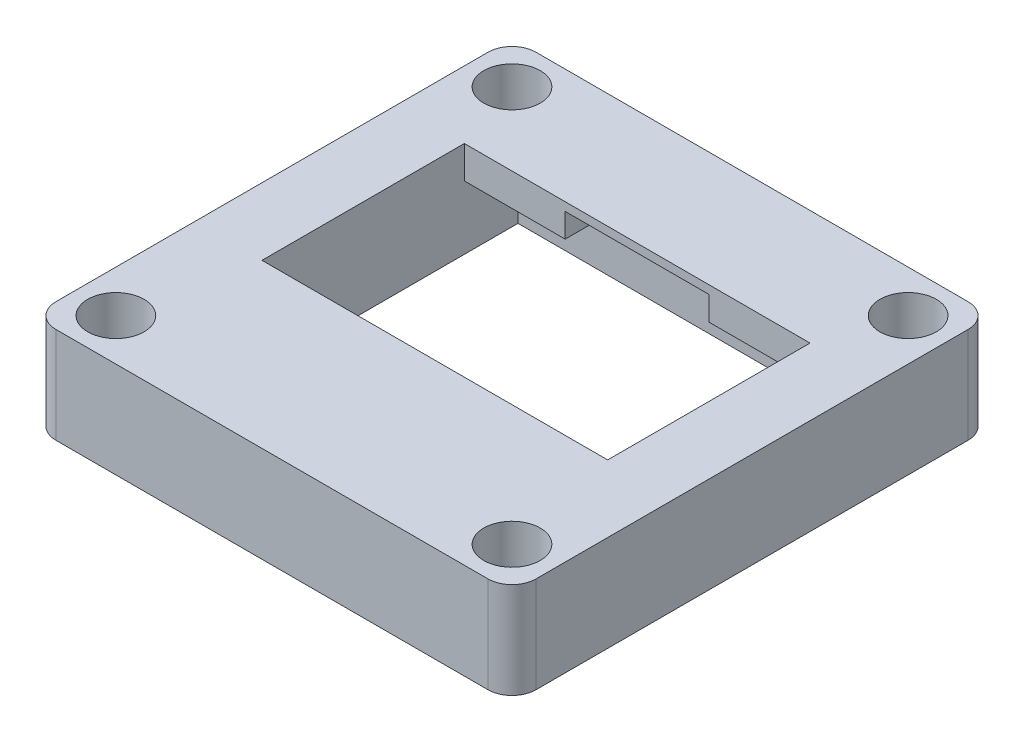
ISO-10303-21;
HEADER;
FILE_DESCRIPTION(('STEP AP214'),'2;1');
FILE_NAME('part.step','',(''),(''),'','','');
FILE_SCHEMA(('AUTOMOTIVE_DESIGN { 1 0 10303 214 1 1 1 1 }'));
ENDSEC;
DATA;
#1=APPLICATION_CONTEXT('core data for automotive mechanical design processes');
#2=APPLICATION_PROTOCOL_DEFINITION('international standard','automotive_design',2000,#1);
#3=PRODUCT_CONTEXT('',#1,'mechanical');
#4=PRODUCT('Part','Part','',(#3));
#5=PRODUCT_RELATED_PRODUCT_CATEGORY('part','',(#4));
#6=PRODUCT_DEFINITION_FORMATION('','',#4);
#7=PRODUCT_DEFINITION_CONTEXT('part definition',#1,'design');
#8=PRODUCT_DEFINITION('design','',#6,#7);
#9=PRODUCT_DEFINITION_SHAPE('','',#8);
#10=(LENGTH_UNIT() NAMED_UNIT(*) SI_UNIT(.MILLI.,.METRE.));
#11=(NAMED_UNIT(*) PLANE_ANGLE_UNIT() SI_UNIT($,.RADIAN.));
#12=(NAMED_UNIT(*) SI_UNIT($,.STERADIAN.) SOLID_ANGLE_UNIT());
#13=UNCERTAINTY_MEASURE_WITH_UNIT(LENGTH_MEASURE(1.E-05),#10,'distance_accuracy_value','');
#14=(GEOMETRIC_REPRESENTATION_CONTEXT(3) GLOBAL_UNCERTAINTY_ASSIGNED_CONTEXT((#13)) GLOBAL_UNIT_ASSIGNED_CONTEXT((#10,
#11,#12)) REPRESENTATION_CONTEXT('',''));
#15=CARTESIAN_POINT('',(0.,0.,0.));
#16=DIRECTION('',(0.,0.,1.));
#17=DIRECTION('',(1.,0.,0.));
#18=AXIS2_PLACEMENT_3D('',#15,#16,#17);
#19=CARTESIAN_POINT('',(-16.5,8.,16.5));
#20=DIRECTION('',(0.,-1.,0.));
#21=DIRECTION('',(0.,0.,-1.));
#22=AXIS2_PLACEMENT_3D('',#19,#20,#21);
#23=CYLINDRICAL_SURFACE('',#22,1.25);
#24=CARTESIAN_POINT('',(-16.5,0.,16.5));
#25=DIRECTION('',(0.,-1.,0.));
#26=DIRECTION('',(0.,0.,-1.));
#27=AXIS2_PLACEMENT_3D('',#24,#25,#26);
#28=CIRCLE('',#27,1.25);
#29=CARTESIAN_POINT('',(-16.5,0.,15.25));
#30=VERTEX_POINT('',#29);
#31=EDGE_CURVE('E238',#30,#30,#28,.T.);
#32=ORIENTED_EDGE('',*,*,#31,.T.);
#33=EDGE_LOOP('',(#32));
#34=FACE_BOUND('',#33,.T.);
#35=CARTESIAN_POINT('',(-16.5,4.,16.5));
#36=DIRECTION('',(0.,1.,0.));
#37=DIRECTION('',(0.,0.,1.));
#38=AXIS2_PLACEMENT_3D('',#35,#36,#37);
#39=CIRCLE('',#38,1.25);
#40=CARTESIAN_POINT('',(-16.5,4.,17.75));
#41=VERTEX_POINT('',#40);
#42=EDGE_CURVE('E40',#41,#41,#39,.F.);
#43=ORIENTED_EDGE('',*,*,#42,.F.);
#44=EDGE_LOOP('',(#43));
#45=FACE_BOUND('',#44,.T.);
#46=ADVANCED_FACE('F36',(#34,#45),#23,.F.);
#47=CARTESIAN_POINT('',(-16.5,8.,-16.5));
#48=DIRECTION('',(0.,-1.,0.));
#49=DIRECTION('',(0.,0.,-1.));
#50=AXIS2_PLACEMENT_3D('',#47,#48,#49);
#51=CYLINDRICAL_SURFACE('',#50,1.25);
#52=CARTESIAN_POINT('',(-16.5,0.,-16.5));
#53=DIRECTION('',(0.,-1.,0.));
#54=DIRECTION('',(0.,0.,-1.));
#55=AXIS2_PLACEMENT_3D('',#52,#53,#54);
#56=CIRCLE('',#55,1.25);
#57=CARTESIAN_POINT('',(-16.5,0.,-17.75));
#58=VERTEX_POINT('',#57);
#59=EDGE_CURVE('E417',#58,#58,#56,.T.);
#60=ORIENTED_EDGE('',*,*,#59,.T.);
#61=EDGE_LOOP('',(#60));
#62=FACE_BOUND('',#61,.T.);
#63=CARTESIAN_POINT('',(-16.5,4.,-16.5));
#64=DIRECTION('',(0.,1.,0.));
#65=DIRECTION('',(0.,0.,1.));
#66=AXIS2_PLACEMENT_3D('',#63,#64,#65);
#67=CIRCLE('',#66,1.25);
#68=CARTESIAN_POINT('',(-16.5,4.,-15.25));
#69=VERTEX_POINT('',#68);
#70=EDGE_CURVE('E412',#69,#69,#67,.F.);
#71=ORIENTED_EDGE('',*,*,#70,.F.);
#72=EDGE_LOOP('',(#71));
#73=FACE_BOUND('',#72,.T.);
#74=ADVANCED_FACE('F512',(#62,#73),#51,.F.);
#75=CARTESIAN_POINT('',(16.5,8.,-16.5));
#76=DIRECTION('',(0.,-1.,0.));
#77=DIRECTION('',(0.,0.,-1.));
#78=AXIS2_PLACEMENT_3D('',#75,#76,#77);
#79=CYLINDRICAL_SURFACE('',#78,1.25);
#80=CARTESIAN_POINT('',(16.5,0.,-16.5));
#81=DIRECTION('',(0.,-1.,0.));
#82=DIRECTION('',(0.,0.,-1.));
#83=AXIS2_PLACEMENT_3D('',#80,#81,#82);
#84=CIRCLE('',#83,1.25);
#85=CARTESIAN_POINT('',(16.5,0.,-17.75));
#86=VERTEX_POINT('',#85);
#87=EDGE_CURVE('E421',#86,#86,#84,.T.);
#88=ORIENTED_EDGE('',*,*,#87,.T.);
#89=EDGE_LOOP('',(#88));
#90=FACE_BOUND('',#89,.T.);
#91=CARTESIAN_POINT('',(16.5,4.,-16.5));
#92=DIRECTION('',(0.,1.,0.));
#93=DIRECTION('',(0.,0.,1.));
#94=AXIS2_PLACEMENT_3D('',#91,#92,#93);
#95=CIRCLE('',#94,1.25);
#96=CARTESIAN_POINT('',(16.5,4.,-15.25));
#97=VERTEX_POINT('',#96);
#98=EDGE_CURVE('E409',#97,#97,#95,.F.);
#99=ORIENTED_EDGE('',*,*,#98,.F.);
#100=EDGE_LOOP('',(#99));
#101=FACE_BOUND('',#100,.T.);
#102=ADVANCED_FACE('F518',(#90,#101),#79,.F.);
#103=CARTESIAN_POINT('',(16.5,8.,16.5));
#104=DIRECTION('',(0.,-1.,0.));
#105=DIRECTION('',(0.,0.,-1.));
#106=AXIS2_PLACEMENT_3D('',#103,#104,#105);
#107=CYLINDRICAL_SURFACE('',#106,1.25);
#108=CARTESIAN_POINT('',(16.5,0.,16.5));
#109=DIRECTION('',(0.,-1.,0.));
#110=DIRECTION('',(0.,0.,-1.));
#111=AXIS2_PLACEMENT_3D('',#108,#109,#110);
#112=CIRCLE('',#111,1.25);
#113=CARTESIAN_POINT('',(16.5,0.,15.25));
#114=VERTEX_POINT('',#113);
#115=EDGE_CURVE('E243',#114,#114,#112,.T.);
#116=ORIENTED_EDGE('',*,*,#115,.T.);
#117=EDGE_LOOP('',(#116));
#118=FACE_BOUND('',#117,.T.);
#119=CARTESIAN_POINT('',(16.5,4.,16.5));
#120=DIRECTION('',(0.,1.,0.));
#121=DIRECTION('',(0.,0.,1.));
#122=AXIS2_PLACEMENT_3D('',#119,#120,#121);
#123=CIRCLE('',#122,1.25);
#124=CARTESIAN_POINT('',(16.5,4.,17.75));
#125=VERTEX_POINT('',#124);
#126=EDGE_CURVE('E406',#125,#125,#123,.F.);
#127=ORIENTED_EDGE('',*,*,#126,.F.);
#128=EDGE_LOOP('',(#127));
#129=FACE_BOUND('',#128,.T.);
#130=ADVANCED_FACE('F615',(#118,#129),#107,.F.);
#131=CARTESIAN_POINT('',(-14.4,49.4424902726658,-14.9));
#132=DIRECTION('',(-1.,0.,0.));
#133=DIRECTION('',(0.,0.,1.));
#134=AXIS2_PLACEMENT_3D('',#131,#132,#133);
#135=PLANE('',#134);
#136=DIRECTION('',(0.,0.,1.));
#137=VECTOR('',#136,1.);
#138=CARTESIAN_POINT('',(-14.4,7.5,6.43));
#139=LINE('',#138,#137);
#140=CARTESIAN_POINT('',(-14.4,7.5,6.43));
#141=VERTEX_POINT('',#140);
#142=CARTESIAN_POINT('',(-14.4,7.5,10.43));
#143=VERTEX_POINT('',#142);
#144=EDGE_CURVE('E226',#141,#143,#139,.T.);
#145=ORIENTED_EDGE('',*,*,#144,.T.);
#146=DIRECTION('',(0.,-1.,0.));
#147=VECTOR('',#146,1.);
#148=CARTESIAN_POINT('',(-14.4,8.,10.43));
#149=LINE('',#148,#147);
#150=CARTESIAN_POINT('',(-14.4,5.3,10.43));
#151=VERTEX_POINT('',#150);
#152=EDGE_CURVE('E210',#143,#151,#149,.T.);
#153=ORIENTED_EDGE('',*,*,#152,.T.);
#154=DIRECTION('',(0.,0.,-1.));
#155=VECTOR('',#154,1.);
#156=CARTESIAN_POINT('',(-14.4,5.3,-14.9));
#157=LINE('',#156,#155);
#158=CARTESIAN_POINT('',(-14.4,5.3,14.9));
#159=VERTEX_POINT('',#158);
#160=EDGE_CURVE('E344',#159,#151,#157,.T.);
#161=ORIENTED_EDGE('',*,*,#160,.F.);
#162=DIRECTION('',(0.,-1.,0.));
#163=VECTOR('',#162,1.);
#164=CARTESIAN_POINT('',(-14.4,49.4424902726658,14.9));
#165=LINE('',#164,#163);
#166=CARTESIAN_POINT('',(-14.4,0.,14.9));
#167=VERTEX_POINT('',#166);
#168=EDGE_CURVE('E333',#159,#167,#165,.T.);
#169=ORIENTED_EDGE('',*,*,#168,.T.);
#170=DIRECTION('',(0.,0.,-1.));
#171=VECTOR('',#170,1.);
#172=CARTESIAN_POINT('',(-14.4,0.,-14.9));
#173=LINE('',#172,#171);
#174=CARTESIAN_POINT('',(-14.4,0.,-14.9));
#175=VERTEX_POINT('',#174);
#176=EDGE_CURVE('E322',#167,#175,#173,.T.);
#177=ORIENTED_EDGE('',*,*,#176,.T.);
#178=DIRECTION('',(0.,-1.,0.));
#179=VECTOR('',#178,1.);
#180=CARTESIAN_POINT('',(-14.4,49.4424902726658,-14.9));
#181=LINE('',#180,#179);
#182=CARTESIAN_POINT('',(-14.4,5.3,-14.9));
#183=VERTEX_POINT('',#182);
#184=EDGE_CURVE('E346',#183,#175,#181,.T.);
#185=ORIENTED_EDGE('',*,*,#184,.F.);
#186=CARTESIAN_POINT('',(-14.4,5.3,-10.43));
#187=VERTEX_POINT('',#186);
#188=EDGE_CURVE('E347',#187,#183,#157,.T.);
#189=ORIENTED_EDGE('',*,*,#188,.F.);
#190=DIRECTION('',(0.,-1.,0.));
#191=VECTOR('',#190,1.);
#192=CARTESIAN_POINT('',(-14.4,8.,-10.43));
#193=LINE('',#192,#191);
#194=CARTESIAN_POINT('',(-14.4,8.,-10.43));
#195=VERTEX_POINT('',#194);
#196=EDGE_CURVE('E222',#195,#187,#193,.T.);
#197=ORIENTED_EDGE('',*,*,#196,.F.);
#198=DIRECTION('',(0.,0.,-1.));
#199=VECTOR('',#198,1.);
#200=CARTESIAN_POINT('',(-14.4,8.,-10.43));
#201=LINE('',#200,#199);
#202=CARTESIAN_POINT('',(-14.4,8.,6.43));
#203=VERTEX_POINT('',#202);
#204=EDGE_CURVE('E301',#203,#195,#201,.T.);
#205=ORIENTED_EDGE('',*,*,#204,.F.);
#206=DIRECTION('',(0.,1.,0.));
#207=VECTOR('',#206,1.);
#208=CARTESIAN_POINT('',(-14.4,8.,6.43));
#209=LINE('',#208,#207);
#210=EDGE_CURVE('E229',#141,#203,#209,.T.);
#211=ORIENTED_EDGE('',*,*,#210,.F.);
#212=EDGE_LOOP('',(#145,#153,#161,#169,#177,#185,#189,#197,#205,#211));
#213=FACE_BOUND('',#212,.T.);
#214=ADVANCED_FACE('F227',(#213),#135,.F.);
#215=CARTESIAN_POINT('',(14.4,49.4424902726658,-14.9));
#216=DIRECTION('',(1.,0.,0.));
#217=DIRECTION('',(0.,0.,-1.));
#218=AXIS2_PLACEMENT_3D('',#215,#216,#217);
#219=PLANE('',#218);
#220=DIRECTION('',(0.,0.,1.));
#221=VECTOR('',#220,1.);
#222=CARTESIAN_POINT('',(14.4,7.5,6.43));
#223=LINE('',#222,#221);
#224=CARTESIAN_POINT('',(14.4,7.5,6.43));
#225=VERTEX_POINT('',#224);
#226=CARTESIAN_POINT('',(14.4,7.5,10.43));
#227=VERTEX_POINT('',#226);
#228=EDGE_CURVE('E233',#225,#227,#223,.T.);
#229=ORIENTED_EDGE('',*,*,#228,.F.);
#230=DIRECTION('',(0.,-1.,0.));
#231=VECTOR('',#230,1.);
#232=CARTESIAN_POINT('',(14.4,8.,6.43));
#233=LINE('',#232,#231);
#234=CARTESIAN_POINT('',(14.4,8.,6.43));
#235=VERTEX_POINT('',#234);
#236=EDGE_CURVE('E430',#235,#225,#233,.T.);
#237=ORIENTED_EDGE('',*,*,#236,.F.);
#238=DIRECTION('',(0.,0.,1.));
#239=VECTOR('',#238,1.);
#240=CARTESIAN_POINT('',(14.4,8.,-10.43));
#241=LINE('',#240,#239);
#242=CARTESIAN_POINT('',(14.4,8.,-10.43));
#243=VERTEX_POINT('',#242);
#244=EDGE_CURVE('E298',#243,#235,#241,.T.);
#245=ORIENTED_EDGE('',*,*,#244,.F.);
#246=DIRECTION('',(0.,-1.,0.));
#247=VECTOR('',#246,1.);
#248=CARTESIAN_POINT('',(14.4,8.,-10.43));
#249=LINE('',#248,#247);
#250=CARTESIAN_POINT('',(14.4,5.3,-10.43));
#251=VERTEX_POINT('',#250);
#252=EDGE_CURVE('E313',#243,#251,#249,.T.);
#253=ORIENTED_EDGE('',*,*,#252,.T.);
#254=DIRECTION('',(0.,0.,1.));
#255=VECTOR('',#254,1.);
#256=CARTESIAN_POINT('',(14.4,5.3,-14.9));
#257=LINE('',#256,#255);
#258=CARTESIAN_POINT('',(14.4,5.3,-14.9));
#259=VERTEX_POINT('',#258);
#260=EDGE_CURVE('E334',#259,#251,#257,.T.);
#261=ORIENTED_EDGE('',*,*,#260,.F.);
#262=DIRECTION('',(0.,-1.,0.));
#263=VECTOR('',#262,1.);
#264=CARTESIAN_POINT('',(14.4,49.4424902726658,-14.9));
#265=LINE('',#264,#263);
#266=CARTESIAN_POINT('',(14.4,0.,-14.9));
#267=VERTEX_POINT('',#266);
#268=EDGE_CURVE('E342',#259,#267,#265,.T.);
#269=ORIENTED_EDGE('',*,*,#268,.T.);
#270=DIRECTION('',(0.,0.,1.));
#271=VECTOR('',#270,1.);
#272=CARTESIAN_POINT('',(14.4,0.,-14.9));
#273=LINE('',#272,#271);
#274=CARTESIAN_POINT('',(14.4,0.,14.9));
#275=VERTEX_POINT('',#274);
#276=EDGE_CURVE('E316',#267,#275,#273,.T.);
#277=ORIENTED_EDGE('',*,*,#276,.T.);
#278=DIRECTION('',(0.,-1.,0.));
#279=VECTOR('',#278,1.);
#280=CARTESIAN_POINT('',(14.4,49.4424902726658,14.9));
#281=LINE('',#280,#279);
#282=CARTESIAN_POINT('',(14.4,5.3,14.9));
#283=VERTEX_POINT('',#282);
#284=EDGE_CURVE('E337',#283,#275,#281,.T.);
#285=ORIENTED_EDGE('',*,*,#284,.F.);
#286=CARTESIAN_POINT('',(14.4,5.3,10.43));
#287=VERTEX_POINT('',#286);
#288=EDGE_CURVE('E338',#287,#283,#257,.T.);
#289=ORIENTED_EDGE('',*,*,#288,.F.);
#290=DIRECTION('',(0.,-1.,0.));
#291=VECTOR('',#290,1.);
#292=CARTESIAN_POINT('',(14.4,8.,10.43));
#293=LINE('',#292,#291);
#294=EDGE_CURVE('E223',#227,#287,#293,.T.);
#295=ORIENTED_EDGE('',*,*,#294,.F.);
#296=EDGE_LOOP('',(#229,#237,#245,#253,#261,#269,#277,#285,#289,#295));
#297=FACE_BOUND('',#296,.T.);
#298=ADVANCED_FACE('F441',(#297),#219,.F.);
#299=CARTESIAN_POINT('',(-14.4,8.,10.43));
#300=DIRECTION('',(0.,0.,1.));
#301=DIRECTION('',(1.,0.,0.));
#302=AXIS2_PLACEMENT_3D('',#299,#300,#301);
#303=PLANE('',#302);
#304=DIRECTION('',(-1.,0.,0.));
#305=VECTOR('',#304,1.);
#306=CARTESIAN_POINT('',(-14.4,7.5,10.43));
#307=LINE('',#306,#305);
#308=EDGE_CURVE('E214',#227,#143,#307,.T.);
#309=ORIENTED_EDGE('',*,*,#308,.F.);
#310=ORIENTED_EDGE('',*,*,#294,.T.);
#311=DIRECTION('',(-1.,0.,0.));
#312=VECTOR('',#311,1.);
#313=CARTESIAN_POINT('',(-14.4,5.3,10.43));
#314=LINE('',#313,#312);
#315=CARTESIAN_POINT('',(6.,5.3,10.43));
#316=VERTEX_POINT('',#315);
#317=EDGE_CURVE('E307',#287,#316,#314,.T.);
#318=ORIENTED_EDGE('',*,*,#317,.T.);
#319=DIRECTION('',(0.,-1.,0.));
#320=VECTOR('',#319,1.);
#321=CARTESIAN_POINT('',(6.,20.8055027234389,10.43));
#322=LINE('',#321,#320);
#323=CARTESIAN_POINT('',(6.,7.3,10.43));
#324=VERTEX_POINT('',#323);
#325=EDGE_CURVE('E282',#324,#316,#322,.T.);
#326=ORIENTED_EDGE('',*,*,#325,.F.);
#327=DIRECTION('',(1.,0.,0.));
#328=VECTOR('',#327,1.);
#329=CARTESIAN_POINT('',(-6.,7.3,10.43));
#330=LINE('',#329,#328);
#331=CARTESIAN_POINT('',(-6.,7.3,10.43));
#332=VERTEX_POINT('',#331);
#333=EDGE_CURVE('E278',#332,#324,#330,.T.);
#334=ORIENTED_EDGE('',*,*,#333,.F.);
#335=DIRECTION('',(0.,-1.,0.));
#336=VECTOR('',#335,1.);
#337=CARTESIAN_POINT('',(-6.,20.8055027234389,10.43));
#338=LINE('',#337,#336);
#339=CARTESIAN_POINT('',(-6.,5.3,10.43));
#340=VERTEX_POINT('',#339);
#341=EDGE_CURVE('E285',#332,#340,#338,.T.);
#342=ORIENTED_EDGE('',*,*,#341,.T.);
#343=EDGE_CURVE('E218',#340,#151,#314,.T.);
#344=ORIENTED_EDGE('',*,*,#343,.T.);
#345=ORIENTED_EDGE('',*,*,#152,.F.);
#346=EDGE_LOOP('',(#309,#310,#318,#326,#334,#342,#344,#345));
#347=FACE_BOUND('',#346,.T.);
#348=ADVANCED_FACE('F212',(#347),#303,.F.);
#349=CARTESIAN_POINT('',(0.,5.3,0.));
#350=DIRECTION('',(0.,1.,0.));
#351=DIRECTION('',(0.,0.,1.));
#352=AXIS2_PLACEMENT_3D('',#349,#350,#351);
#353=PLANE('',#352);
#354=DIRECTION('',(1.,0.,0.));
#355=VECTOR('',#354,1.);
#356=CARTESIAN_POINT('',(-14.4,5.3,-14.9));
#357=LINE('',#356,#355);
#358=CARTESIAN_POINT('',(-6.,5.3,-14.9));
#359=VERTEX_POINT('',#358);
#360=EDGE_CURVE('E339',#183,#359,#357,.T.);
#361=ORIENTED_EDGE('',*,*,#360,.T.);
#362=DIRECTION('',(0.,0.,-1.));
#363=VECTOR('',#362,1.);
#364=CARTESIAN_POINT('',(-6.,5.3,-10.43));
#365=LINE('',#364,#363);
#366=CARTESIAN_POINT('',(-6.,5.3,-10.43));
#367=VERTEX_POINT('',#366);
#368=EDGE_CURVE('E250',#367,#359,#365,.T.);
#369=ORIENTED_EDGE('',*,*,#368,.F.);
#370=DIRECTION('',(1.,0.,0.));
#371=VECTOR('',#370,1.);
#372=CARTESIAN_POINT('',(-14.4,5.3,-10.43));
#373=LINE('',#372,#371);
#374=EDGE_CURVE('E302',#187,#367,#373,.T.);
#375=ORIENTED_EDGE('',*,*,#374,.F.);
#376=ORIENTED_EDGE('',*,*,#188,.T.);
#377=EDGE_LOOP('',(#361,#369,#375,#376));
#378=FACE_BOUND('',#377,.T.);
#379=ADVANCED_FACE('F498',(#378),#353,.F.);
#380=DIRECTION('',(-1.,0.,0.));
#381=VECTOR('',#380,1.);
#382=CARTESIAN_POINT('',(-14.4,5.3,14.9));
#383=LINE('',#382,#381);
#384=CARTESIAN_POINT('',(6.,5.3,14.9));
#385=VERTEX_POINT('',#384);
#386=EDGE_CURVE('E330',#283,#385,#383,.T.);
#387=ORIENTED_EDGE('',*,*,#386,.T.);
#388=DIRECTION('',(0.,0.,1.));
#389=VECTOR('',#388,1.);
#390=CARTESIAN_POINT('',(6.,5.3,10.43));
#391=LINE('',#390,#389);
#392=EDGE_CURVE('E275',#316,#385,#391,.T.);
#393=ORIENTED_EDGE('',*,*,#392,.F.);
#394=ORIENTED_EDGE('',*,*,#317,.F.);
#395=ORIENTED_EDGE('',*,*,#288,.T.);
#396=EDGE_LOOP('',(#387,#393,#394,#395));
#397=FACE_BOUND('',#396,.T.);
#398=ADVANCED_FACE('F449',(#397),#353,.F.);
#399=ORIENTED_EDGE('',*,*,#343,.F.);
#400=DIRECTION('',(0.,0.,-1.));
#401=VECTOR('',#400,1.);
#402=CARTESIAN_POINT('',(-6.,5.3,10.43));
#403=LINE('',#402,#401);
#404=CARTESIAN_POINT('',(-6.,5.3,14.9));
#405=VERTEX_POINT('',#404);
#406=EDGE_CURVE('E274',#405,#340,#403,.T.);
#407=ORIENTED_EDGE('',*,*,#406,.F.);
#408=EDGE_CURVE('E321',#405,#159,#383,.T.);
#409=ORIENTED_EDGE('',*,*,#408,.T.);
#410=ORIENTED_EDGE('',*,*,#160,.T.);
#411=EDGE_LOOP('',(#399,#407,#409,#410));
#412=FACE_BOUND('',#411,.T.);
#413=ADVANCED_FACE('F464',(#412),#353,.F.);
#414=CARTESIAN_POINT('',(6.,5.3,-10.43));
#415=VERTEX_POINT('',#414);
#416=EDGE_CURVE('E310',#415,#251,#373,.T.);
#417=ORIENTED_EDGE('',*,*,#416,.F.);
#418=DIRECTION('',(0.,0.,1.));
#419=VECTOR('',#418,1.);
#420=CARTESIAN_POINT('',(6.,5.3,-10.43));
#421=LINE('',#420,#419);
#422=CARTESIAN_POINT('',(6.,5.3,-14.9));
#423=VERTEX_POINT('',#422);
#424=EDGE_CURVE('E249',#423,#415,#421,.T.);
#425=ORIENTED_EDGE('',*,*,#424,.F.);
#426=EDGE_CURVE('E343',#423,#259,#357,.T.);
#427=ORIENTED_EDGE('',*,*,#426,.T.);
#428=ORIENTED_EDGE('',*,*,#260,.T.);
#429=EDGE_LOOP('',(#417,#425,#427,#428));
#430=FACE_BOUND('',#429,.T.);
#431=ADVANCED_FACE('F484',(#430),#353,.F.);
#432=CARTESIAN_POINT('',(20.,8.,-20.));
#433=DIRECTION('',(-1.,0.,0.));
#434=DIRECTION('',(0.,0.,1.));
#435=AXIS2_PLACEMENT_3D('',#432,#433,#434);
#436=PLANE('',#435);
#437=DIRECTION('',(0.,0.,-1.));
#438=VECTOR('',#437,1.);
#439=CARTESIAN_POINT('',(20.,0.,-20.));
#440=LINE('',#439,#438);
#441=CARTESIAN_POINT('',(20.,0.,18.));
#442=VERTEX_POINT('',#441);
#443=CARTESIAN_POINT('',(20.,0.,-18.));
#444=VERTEX_POINT('',#443);
#445=EDGE_CURVE('E353',#442,#444,#440,.T.);
#446=ORIENTED_EDGE('',*,*,#445,.T.);
#447=DIRECTION('',(0.,-1.,0.));
#448=VECTOR('',#447,1.);
#449=CARTESIAN_POINT('',(20.,8.,-18.));
#450=LINE('',#449,#448);
#451=CARTESIAN_POINT('',(20.,8.,-18.));
#452=VERTEX_POINT('',#451);
#453=EDGE_CURVE('E402',#444,#452,#450,.F.);
#454=ORIENTED_EDGE('',*,*,#453,.T.);
#455=DIRECTION('',(0.,0.,-1.));
#456=VECTOR('',#455,1.);
#457=CARTESIAN_POINT('',(20.,8.,-20.));
#458=LINE('',#457,#456);
#459=CARTESIAN_POINT('',(20.,8.,18.));
#460=VERTEX_POINT('',#459);
#461=EDGE_CURVE('E354',#460,#452,#458,.T.);
#462=ORIENTED_EDGE('',*,*,#461,.F.);
#463=DIRECTION('',(0.,-1.,0.));
#464=VECTOR('',#463,1.);
#465=CARTESIAN_POINT('',(20.,8.,18.));
#466=LINE('',#465,#464);
#467=EDGE_CURVE('E399',#460,#442,#466,.T.);
#468=ORIENTED_EDGE('',*,*,#467,.T.);
#469=EDGE_LOOP('',(#446,#454,#462,#468));
#470=FACE_BOUND('',#469,.T.);
#471=ADVANCED_FACE('F539',(#470),#436,.F.);
#472=CARTESIAN_POINT('',(-20.,8.,-20.));
#473=DIRECTION('',(0.,0.,1.));
#474=DIRECTION('',(1.,0.,0.));
#475=AXIS2_PLACEMENT_3D('',#472,#473,#474);
#476=PLANE('',#475);
#477=DIRECTION('',(-1.,0.,0.));
#478=VECTOR('',#477,1.);
#479=CARTESIAN_POINT('',(-20.,0.,-20.));
#480=LINE('',#479,#478);
#481=CARTESIAN_POINT('',(18.,0.,-20.));
#482=VERTEX_POINT('',#481);
#483=CARTESIAN_POINT('',(-18.,0.,-20.));
#484=VERTEX_POINT('',#483);
#485=EDGE_CURVE('E368',#482,#484,#480,.T.);
#486=ORIENTED_EDGE('',*,*,#485,.T.);
#487=DIRECTION('',(0.,-1.,0.));
#488=VECTOR('',#487,1.);
#489=CARTESIAN_POINT('',(-18.,8.,-20.));
#490=LINE('',#489,#488);
#491=CARTESIAN_POINT('',(-18.,8.,-20.));
#492=VERTEX_POINT('',#491);
#493=EDGE_CURVE('E390',#484,#492,#490,.F.);
#494=ORIENTED_EDGE('',*,*,#493,.T.);
#495=DIRECTION('',(-1.,0.,0.));
#496=VECTOR('',#495,1.);
#497=CARTESIAN_POINT('',(-20.,8.,-20.));
#498=LINE('',#497,#496);
#499=CARTESIAN_POINT('',(18.,8.,-20.));
#500=VERTEX_POINT('',#499);
#501=EDGE_CURVE('E357',#500,#492,#498,.T.);
#502=ORIENTED_EDGE('',*,*,#501,.F.);
#503=DIRECTION('',(0.,-1.,0.));
#504=VECTOR('',#503,1.);
#505=CARTESIAN_POINT('',(18.,8.,-20.));
#506=LINE('',#505,#504);
#507=EDGE_CURVE('E387',#500,#482,#506,.T.);
#508=ORIENTED_EDGE('',*,*,#507,.T.);
#509=EDGE_LOOP('',(#486,#494,#502,#508));
#510=FACE_BOUND('',#509,.T.);
#511=ADVANCED_FACE('F558',(#510),#476,.F.);
#512=CARTESIAN_POINT('',(-20.,8.,-20.));
#513=DIRECTION('',(1.,0.,0.));
#514=DIRECTION('',(0.,0.,-1.));
#515=AXIS2_PLACEMENT_3D('',#512,#513,#514);
#516=PLANE('',#515);
#517=DIRECTION('',(0.,0.,1.));
#518=VECTOR('',#517,1.);
#519=CARTESIAN_POINT('',(-20.,8.,-20.));
#520=LINE('',#519,#518);
#521=CARTESIAN_POINT('',(-20.,8.,-18.));
#522=VERTEX_POINT('',#521);
#523=CARTESIAN_POINT('',(-20.,8.,18.));
#524=VERTEX_POINT('',#523);
#525=EDGE_CURVE('E361',#522,#524,#520,.T.);
#526=ORIENTED_EDGE('',*,*,#525,.F.);
#527=DIRECTION('',(0.,-1.,0.));
#528=VECTOR('',#527,1.);
#529=CARTESIAN_POINT('',(-20.,8.,-18.));
#530=LINE('',#529,#528);
#531=CARTESIAN_POINT('',(-20.,0.,-18.));
#532=VERTEX_POINT('',#531);
#533=EDGE_CURVE('E376',#522,#532,#530,.T.);
#534=ORIENTED_EDGE('',*,*,#533,.T.);
#535=DIRECTION('',(0.,0.,1.));
#536=VECTOR('',#535,1.);
#537=CARTESIAN_POINT('',(-20.,0.,-20.));
#538=LINE('',#537,#536);
#539=CARTESIAN_POINT('',(-20.,0.,18.));
#540=VERTEX_POINT('',#539);
#541=EDGE_CURVE('E371',#532,#540,#538,.T.);
#542=ORIENTED_EDGE('',*,*,#541,.T.);
#543=DIRECTION('',(0.,-1.,0.));
#544=VECTOR('',#543,1.);
#545=CARTESIAN_POINT('',(-20.,8.,18.));
#546=LINE('',#545,#544);
#547=EDGE_CURVE('E365',#540,#524,#546,.F.);
#548=ORIENTED_EDGE('',*,*,#547,.T.);
#549=EDGE_LOOP('',(#526,#534,#542,#548));
#550=FACE_BOUND('',#549,.T.);
#551=ADVANCED_FACE('F564',(#550),#516,.F.);
#552=CARTESIAN_POINT('',(-20.,8.,20.));
#553=DIRECTION('',(0.,0.,-1.));
#554=DIRECTION('',(-1.,0.,0.));
#555=AXIS2_PLACEMENT_3D('',#552,#553,#554);
#556=PLANE('',#555);
#557=DIRECTION('',(1.,0.,0.));
#558=VECTOR('',#557,1.);
#559=CARTESIAN_POINT('',(-20.,0.,20.));
#560=LINE('',#559,#558);
#561=CARTESIAN_POINT('',(-18.,0.,20.));
#562=VERTEX_POINT('',#561);
#563=CARTESIAN_POINT('',(18.,0.,20.));
#564=VERTEX_POINT('',#563);
#565=EDGE_CURVE('E358',#562,#564,#560,.T.);
#566=ORIENTED_EDGE('',*,*,#565,.T.);
#567=DIRECTION('',(0.,-1.,0.));
#568=VECTOR('',#567,1.);
#569=CARTESIAN_POINT('',(18.,8.,20.));
#570=LINE('',#569,#568);
#571=CARTESIAN_POINT('',(18.,8.,20.));
#572=VERTEX_POINT('',#571);
#573=EDGE_CURVE('E12',#564,#572,#570,.F.);
#574=ORIENTED_EDGE('',*,*,#573,.T.);
#575=DIRECTION('',(1.,0.,0.));
#576=VECTOR('',#575,1.);
#577=CARTESIAN_POINT('',(-20.,8.,20.));
#578=LINE('',#577,#576);
#579=CARTESIAN_POINT('',(-18.,8.,20.));
#580=VERTEX_POINT('',#579);
#581=EDGE_CURVE('E363',#580,#572,#578,.T.);
#582=ORIENTED_EDGE('',*,*,#581,.F.);
#583=DIRECTION('',(0.,-1.,0.));
#584=VECTOR('',#583,1.);
#585=CARTESIAN_POINT('',(-18.,8.,20.));
#586=LINE('',#585,#584);
#587=EDGE_CURVE('E45',#580,#562,#586,.T.);
#588=ORIENTED_EDGE('',*,*,#587,.T.);
#589=EDGE_LOOP('',(#566,#574,#582,#588));
#590=FACE_BOUND('',#589,.T.);
#591=ADVANCED_FACE('F569',(#590),#556,.F.);
#592=CARTESIAN_POINT('',(0.,8.,0.));
#593=DIRECTION('',(0.,1.,0.));
#594=DIRECTION('',(0.,0.,1.));
#595=AXIS2_PLACEMENT_3D('',#592,#593,#594);
#596=PLANE('',#595);
#597=CARTESIAN_POINT('',(16.5,8.,-16.5));
#598=DIRECTION('',(0.,1.,0.));
#599=DIRECTION('',(0.,0.,1.));
#600=AXIS2_PLACEMENT_3D('',#597,#598,#599);
#601=CIRCLE('',#600,2.35);
#602=CARTESIAN_POINT('',(16.5,8.,-14.15));
#603=VERTEX_POINT('',#602);
#604=EDGE_CURVE('E680',#603,#603,#601,.T.);
#605=ORIENTED_EDGE('',*,*,#604,.F.);
#606=EDGE_LOOP('',(#605));
#607=FACE_BOUND('',#606,.T.);
#608=CARTESIAN_POINT('',(16.5,8.,16.5));
#609=DIRECTION('',(0.,1.,0.));
#610=DIRECTION('',(0.,0.,1.));
#611=AXIS2_PLACEMENT_3D('',#608,#609,#610);
#612=CIRCLE('',#611,2.35);
#613=CARTESIAN_POINT('',(16.5,8.,18.85));
#614=VERTEX_POINT('',#613);
#615=EDGE_CURVE('E674',#614,#614,#612,.T.);
#616=ORIENTED_EDGE('',*,*,#615,.F.);
#617=EDGE_LOOP('',(#616));
#618=FACE_BOUND('',#617,.T.);
#619=CARTESIAN_POINT('',(-16.5,8.,16.5));
#620=DIRECTION('',(0.,1.,0.));
#621=DIRECTION('',(0.,0.,1.));
#622=AXIS2_PLACEMENT_3D('',#619,#620,#621);
#623=CIRCLE('',#622,2.35);
#624=CARTESIAN_POINT('',(-16.5,8.,18.85));
#625=VERTEX_POINT('',#624);
#626=EDGE_CURVE('E664',#625,#625,#623,.T.);
#627=ORIENTED_EDGE('',*,*,#626,.F.);
#628=EDGE_LOOP('',(#627));
#629=FACE_BOUND('',#628,.T.);
#630=CARTESIAN_POINT('',(-16.5,8.,-16.5));
#631=DIRECTION('',(0.,1.,0.));
#632=DIRECTION('',(0.,0.,1.));
#633=AXIS2_PLACEMENT_3D('',#630,#631,#632);
#634=CIRCLE('',#633,2.35);
#635=CARTESIAN_POINT('',(-16.5,8.,-14.15));
#636=VERTEX_POINT('',#635);
#637=EDGE_CURVE('E663',#636,#636,#634,.T.);
#638=ORIENTED_EDGE('',*,*,#637,.F.);
#639=EDGE_LOOP('',(#638));
#640=FACE_BOUND('',#639,.T.);
#641=DIRECTION('',(1.,0.,0.));
#642=VECTOR('',#641,1.);
#643=CARTESIAN_POINT('',(-14.4,8.,6.43));
#644=LINE('',#643,#642);
#645=EDGE_CURVE('E240',#203,#235,#644,.T.);
#646=ORIENTED_EDGE('',*,*,#645,.F.);
#647=ORIENTED_EDGE('',*,*,#204,.T.);
#648=DIRECTION('',(1.,0.,0.));
#649=VECTOR('',#648,1.);
#650=CARTESIAN_POINT('',(-14.4,8.,-10.43));
#651=LINE('',#650,#649);
#652=EDGE_CURVE('E304',#195,#243,#651,.T.);
#653=ORIENTED_EDGE('',*,*,#652,.T.);
#654=ORIENTED_EDGE('',*,*,#244,.T.);
#655=EDGE_LOOP('',(#646,#647,#653,#654));
#656=FACE_BOUND('',#655,.T.);
#657=ORIENTED_EDGE('',*,*,#501,.T.);
#658=CARTESIAN_POINT('',(-18.,8.,-18.));
#659=DIRECTION('',(0.,1.,0.));
#660=DIRECTION('',(0.,0.,1.));
#661=AXIS2_PLACEMENT_3D('',#658,#659,#660);
#662=CIRCLE('',#661,2.);
#663=EDGE_CURVE('E397',#492,#522,#662,.T.);
#664=ORIENTED_EDGE('',*,*,#663,.T.);
#665=ORIENTED_EDGE('',*,*,#525,.T.);
#666=CARTESIAN_POINT('',(-18.,8.,18.));
#667=DIRECTION('',(0.,1.,0.));
#668=DIRECTION('',(0.,0.,1.));
#669=AXIS2_PLACEMENT_3D('',#666,#667,#668);
#670=CIRCLE('',#669,2.);
#671=EDGE_CURVE('E58',#524,#580,#670,.T.);
#672=ORIENTED_EDGE('',*,*,#671,.T.);
#673=ORIENTED_EDGE('',*,*,#581,.T.);
#674=CARTESIAN_POINT('',(18.,8.,18.));
#675=DIRECTION('',(0.,1.,0.));
#676=DIRECTION('',(0.,0.,1.));
#677=AXIS2_PLACEMENT_3D('',#674,#675,#676);
#678=CIRCLE('',#677,2.);
#679=EDGE_CURVE('E393',#572,#460,#678,.T.);
#680=ORIENTED_EDGE('',*,*,#679,.T.);
#681=ORIENTED_EDGE('',*,*,#461,.T.);
#682=CARTESIAN_POINT('',(18.,8.,-18.));
#683=DIRECTION('',(0.,1.,0.));
#684=DIRECTION('',(0.,0.,1.));
#685=AXIS2_PLACEMENT_3D('',#682,#683,#684);
#686=CIRCLE('',#685,2.);
#687=EDGE_CURVE('E395',#452,#500,#686,.T.);
#688=ORIENTED_EDGE('',*,*,#687,.T.);
#689=EDGE_LOOP('',(#657,#664,#665,#672,#673,#680,#681,#688));
#690=FACE_BOUND('',#689,.T.);
#691=ADVANCED_FACE('F436',(#607,#618,#629,#640,#656,#690),#596,.T.);
#692=CARTESIAN_POINT('',(0.,0.,0.));
#693=DIRECTION('',(0.,1.,0.));
#694=DIRECTION('',(0.,0.,1.));
#695=AXIS2_PLACEMENT_3D('',#692,#693,#694);
#696=PLANE('',#695);
#697=ORIENTED_EDGE('',*,*,#115,.F.);
#698=EDGE_LOOP('',(#697));
#699=FACE_BOUND('',#698,.T.);
#700=ORIENTED_EDGE('',*,*,#87,.F.);
#701=EDGE_LOOP('',(#700));
#702=FACE_BOUND('',#701,.T.);
#703=ORIENTED_EDGE('',*,*,#59,.F.);
#704=EDGE_LOOP('',(#703));
#705=FACE_BOUND('',#704,.T.);
#706=ORIENTED_EDGE('',*,*,#31,.F.);
#707=EDGE_LOOP('',(#706));
#708=FACE_BOUND('',#707,.T.);
#709=ORIENTED_EDGE('',*,*,#176,.F.);
#710=DIRECTION('',(-1.,0.,0.));
#711=VECTOR('',#710,1.);
#712=CARTESIAN_POINT('',(-14.4,0.,14.9));
#713=LINE('',#712,#711);
#714=EDGE_CURVE('E325',#275,#167,#713,.T.);
#715=ORIENTED_EDGE('',*,*,#714,.F.);
#716=ORIENTED_EDGE('',*,*,#276,.F.);
#717=DIRECTION('',(1.,0.,0.));
#718=VECTOR('',#717,1.);
#719=CARTESIAN_POINT('',(-14.4,0.,-14.9));
#720=LINE('',#719,#718);
#721=EDGE_CURVE('E319',#175,#267,#720,.T.);
#722=ORIENTED_EDGE('',*,*,#721,.F.);
#723=EDGE_LOOP('',(#709,#715,#716,#722));
#724=FACE_BOUND('',#723,.T.);
#725=ORIENTED_EDGE('',*,*,#541,.F.);
#726=CARTESIAN_POINT('',(-18.,0.,-18.));
#727=DIRECTION('',(0.,1.,0.));
#728=DIRECTION('',(0.,0.,1.));
#729=AXIS2_PLACEMENT_3D('',#726,#727,#728);
#730=CIRCLE('',#729,2.);
#731=EDGE_CURVE('E385',#532,#484,#730,.F.);
#732=ORIENTED_EDGE('',*,*,#731,.T.);
#733=ORIENTED_EDGE('',*,*,#485,.F.);
#734=CARTESIAN_POINT('',(18.,0.,-18.));
#735=DIRECTION('',(0.,1.,0.));
#736=DIRECTION('',(0.,0.,1.));
#737=AXIS2_PLACEMENT_3D('',#734,#735,#736);
#738=CIRCLE('',#737,2.);
#739=EDGE_CURVE('E383',#482,#444,#738,.F.);
#740=ORIENTED_EDGE('',*,*,#739,.T.);
#741=ORIENTED_EDGE('',*,*,#445,.F.);
#742=CARTESIAN_POINT('',(18.,0.,18.));
#743=DIRECTION('',(0.,1.,0.));
#744=DIRECTION('',(0.,0.,1.));
#745=AXIS2_PLACEMENT_3D('',#742,#743,#744);
#746=CIRCLE('',#745,2.);
#747=EDGE_CURVE('E381',#442,#564,#746,.F.);
#748=ORIENTED_EDGE('',*,*,#747,.T.);
#749=ORIENTED_EDGE('',*,*,#565,.F.);
#750=CARTESIAN_POINT('',(-18.,0.,18.));
#751=DIRECTION('',(0.,1.,0.));
#752=DIRECTION('',(0.,0.,1.));
#753=AXIS2_PLACEMENT_3D('',#750,#751,#752);
#754=CIRCLE('',#753,2.);
#755=EDGE_CURVE('E379',#562,#540,#754,.F.);
#756=ORIENTED_EDGE('',*,*,#755,.T.);
#757=EDGE_LOOP('',(#725,#732,#733,#740,#741,#748,#749,#756));
#758=FACE_BOUND('',#757,.T.);
#759=ADVANCED_FACE('F475',(#699,#702,#705,#708,#724,#758),#696,.F.);
#760=CARTESIAN_POINT('',(-14.4,49.4424902726658,14.9));
#761=DIRECTION('',(0.,0.,1.));
#762=DIRECTION('',(1.,0.,0.));
#763=AXIS2_PLACEMENT_3D('',#760,#761,#762);
#764=PLANE('',#763);
#765=ORIENTED_EDGE('',*,*,#284,.T.);
#766=ORIENTED_EDGE('',*,*,#714,.T.);
#767=ORIENTED_EDGE('',*,*,#168,.F.);
#768=ORIENTED_EDGE('',*,*,#408,.F.);
#769=DIRECTION('',(0.,-1.,0.));
#770=VECTOR('',#769,1.);
#771=CARTESIAN_POINT('',(-6.,20.8055027234389,14.9));
#772=LINE('',#771,#770);
#773=CARTESIAN_POINT('',(-6.,7.3,14.9));
#774=VERTEX_POINT('',#773);
#775=EDGE_CURVE('E286',#774,#405,#772,.T.);
#776=ORIENTED_EDGE('',*,*,#775,.F.);
#777=DIRECTION('',(-1.,0.,0.));
#778=VECTOR('',#777,1.);
#779=CARTESIAN_POINT('',(-6.,7.3,14.9));
#780=LINE('',#779,#778);
#781=CARTESIAN_POINT('',(6.,7.3,14.9));
#782=VERTEX_POINT('',#781);
#783=EDGE_CURVE('E287',#782,#774,#780,.T.);
#784=ORIENTED_EDGE('',*,*,#783,.F.);
#785=DIRECTION('',(0.,-1.,0.));
#786=VECTOR('',#785,1.);
#787=CARTESIAN_POINT('',(6.,20.8055027234389,14.9));
#788=LINE('',#787,#786);
#789=EDGE_CURVE('E290',#782,#385,#788,.T.);
#790=ORIENTED_EDGE('',*,*,#789,.T.);
#791=ORIENTED_EDGE('',*,*,#386,.F.);
#792=EDGE_LOOP('',(#765,#766,#767,#768,#776,#784,#790,#791));
#793=FACE_BOUND('',#792,.T.);
#794=ADVANCED_FACE('F467',(#793),#764,.F.);
#795=CARTESIAN_POINT('',(-14.4,49.4424902726658,-14.9));
#796=DIRECTION('',(0.,0.,-1.));
#797=DIRECTION('',(-1.,0.,0.));
#798=AXIS2_PLACEMENT_3D('',#795,#796,#797);
#799=PLANE('',#798);
#800=ORIENTED_EDGE('',*,*,#184,.T.);
#801=ORIENTED_EDGE('',*,*,#721,.T.);
#802=ORIENTED_EDGE('',*,*,#268,.F.);
#803=ORIENTED_EDGE('',*,*,#426,.F.);
#804=DIRECTION('',(0.,-1.,0.));
#805=VECTOR('',#804,1.);
#806=CARTESIAN_POINT('',(6.,20.8055027234389,-14.9));
#807=LINE('',#806,#805);
#808=CARTESIAN_POINT('',(6.,7.3,-14.9));
#809=VERTEX_POINT('',#808);
#810=EDGE_CURVE('E261',#809,#423,#807,.T.);
#811=ORIENTED_EDGE('',*,*,#810,.F.);
#812=DIRECTION('',(1.,0.,0.));
#813=VECTOR('',#812,1.);
#814=CARTESIAN_POINT('',(6.,7.3,-14.9));
#815=LINE('',#814,#813);
#816=CARTESIAN_POINT('',(-6.,7.3,-14.9));
#817=VERTEX_POINT('',#816);
#818=EDGE_CURVE('E262',#817,#809,#815,.T.);
#819=ORIENTED_EDGE('',*,*,#818,.F.);
#820=DIRECTION('',(0.,-1.,0.));
#821=VECTOR('',#820,1.);
#822=CARTESIAN_POINT('',(-6.,20.8055027234389,-14.9));
#823=LINE('',#822,#821);
#824=EDGE_CURVE('E265',#817,#359,#823,.T.);
#825=ORIENTED_EDGE('',*,*,#824,.T.);
#826=ORIENTED_EDGE('',*,*,#360,.F.);
#827=EDGE_LOOP('',(#800,#801,#802,#803,#811,#819,#825,#826));
#828=FACE_BOUND('',#827,.T.);
#829=ADVANCED_FACE('F479',(#828),#799,.F.);
#830=CARTESIAN_POINT('',(-14.4,8.,-10.43));
#831=DIRECTION('',(0.,0.,-1.));
#832=DIRECTION('',(-1.,0.,0.));
#833=AXIS2_PLACEMENT_3D('',#830,#831,#832);
#834=PLANE('',#833);
#835=ORIENTED_EDGE('',*,*,#374,.T.);
#836=DIRECTION('',(0.,-1.,0.));
#837=VECTOR('',#836,1.);
#838=CARTESIAN_POINT('',(-6.,20.8055027234389,-10.43));
#839=LINE('',#838,#837);
#840=CARTESIAN_POINT('',(-6.,7.3,-10.43));
#841=VERTEX_POINT('',#840);
#842=EDGE_CURVE('E257',#841,#367,#839,.T.);
#843=ORIENTED_EDGE('',*,*,#842,.F.);
#844=DIRECTION('',(-1.,0.,0.));
#845=VECTOR('',#844,1.);
#846=CARTESIAN_POINT('',(6.,7.3,-10.43));
#847=LINE('',#846,#845);
#848=CARTESIAN_POINT('',(6.,7.3,-10.43));
#849=VERTEX_POINT('',#848);
#850=EDGE_CURVE('E253',#849,#841,#847,.T.);
#851=ORIENTED_EDGE('',*,*,#850,.F.);
#852=DIRECTION('',(0.,-1.,0.));
#853=VECTOR('',#852,1.);
#854=CARTESIAN_POINT('',(6.,20.8055027234389,-10.43));
#855=LINE('',#854,#853);
#856=EDGE_CURVE('E260',#849,#415,#855,.T.);
#857=ORIENTED_EDGE('',*,*,#856,.T.);
#858=ORIENTED_EDGE('',*,*,#416,.T.);
#859=ORIENTED_EDGE('',*,*,#252,.F.);
#860=ORIENTED_EDGE('',*,*,#652,.F.);
#861=ORIENTED_EDGE('',*,*,#196,.T.);
#862=EDGE_LOOP('',(#835,#843,#851,#857,#858,#859,#860,#861));
#863=FACE_BOUND('',#862,.T.);
#864=ADVANCED_FACE('F501',(#863),#834,.F.);
#865=CARTESIAN_POINT('',(0.,7.3,0.));
#866=DIRECTION('',(0.,1.,0.));
#867=DIRECTION('',(0.,0.,1.));
#868=AXIS2_PLACEMENT_3D('',#865,#866,#867);
#869=PLANE('',#868);
#870=DIRECTION('',(0.,0.,-1.));
#871=VECTOR('',#870,1.);
#872=CARTESIAN_POINT('',(-6.,7.3,10.43));
#873=LINE('',#872,#871);
#874=EDGE_CURVE('E283',#774,#332,#873,.T.);
#875=ORIENTED_EDGE('',*,*,#874,.T.);
#876=ORIENTED_EDGE('',*,*,#333,.T.);
#877=DIRECTION('',(0.,0.,1.));
#878=VECTOR('',#877,1.);
#879=CARTESIAN_POINT('',(6.,7.3,10.43));
#880=LINE('',#879,#878);
#881=EDGE_CURVE('E291',#324,#782,#880,.T.);
#882=ORIENTED_EDGE('',*,*,#881,.T.);
#883=ORIENTED_EDGE('',*,*,#783,.T.);
#884=EDGE_LOOP('',(#875,#876,#882,#883));
#885=FACE_BOUND('',#884,.T.);
#886=ADVANCED_FACE('F457',(#885),#869,.F.);
#887=CARTESIAN_POINT('',(6.,20.8055027234389,10.43));
#888=DIRECTION('',(1.,0.,0.));
#889=DIRECTION('',(0.,0.,-1.));
#890=AXIS2_PLACEMENT_3D('',#887,#888,#889);
#891=PLANE('',#890);
#892=ORIENTED_EDGE('',*,*,#325,.T.);
#893=ORIENTED_EDGE('',*,*,#392,.T.);
#894=ORIENTED_EDGE('',*,*,#789,.F.);
#895=ORIENTED_EDGE('',*,*,#881,.F.);
#896=EDGE_LOOP('',(#892,#893,#894,#895));
#897=FACE_BOUND('',#896,.T.);
#898=ADVANCED_FACE('F453',(#897),#891,.F.);
#899=CARTESIAN_POINT('',(-6.,20.8055027234389,10.43));
#900=DIRECTION('',(-1.,0.,0.));
#901=DIRECTION('',(0.,0.,1.));
#902=AXIS2_PLACEMENT_3D('',#899,#900,#901);
#903=PLANE('',#902);
#904=ORIENTED_EDGE('',*,*,#775,.T.);
#905=ORIENTED_EDGE('',*,*,#406,.T.);
#906=ORIENTED_EDGE('',*,*,#341,.F.);
#907=ORIENTED_EDGE('',*,*,#874,.F.);
#908=EDGE_LOOP('',(#904,#905,#906,#907));
#909=FACE_BOUND('',#908,.T.);
#910=ADVANCED_FACE('F460',(#909),#903,.F.);
#911=CARTESIAN_POINT('',(0.,7.3,0.));
#912=DIRECTION('',(0.,1.,0.));
#913=DIRECTION('',(0.,0.,1.));
#914=AXIS2_PLACEMENT_3D('',#911,#912,#913);
#915=PLANE('',#914);
#916=DIRECTION('',(0.,0.,1.));
#917=VECTOR('',#916,1.);
#918=CARTESIAN_POINT('',(6.,7.3,-10.43));
#919=LINE('',#918,#917);
#920=EDGE_CURVE('E258',#809,#849,#919,.T.);
#921=ORIENTED_EDGE('',*,*,#920,.T.);
#922=ORIENTED_EDGE('',*,*,#850,.T.);
#923=DIRECTION('',(0.,0.,-1.));
#924=VECTOR('',#923,1.);
#925=CARTESIAN_POINT('',(-6.,7.3,-10.43));
#926=LINE('',#925,#924);
#927=EDGE_CURVE('E266',#841,#817,#926,.T.);
#928=ORIENTED_EDGE('',*,*,#927,.T.);
#929=ORIENTED_EDGE('',*,*,#818,.T.);
#930=EDGE_LOOP('',(#921,#922,#928,#929));
#931=FACE_BOUND('',#930,.T.);
#932=ADVANCED_FACE('F490',(#931),#915,.F.);
#933=CARTESIAN_POINT('',(-6.,20.8055027234389,-10.43));
#934=DIRECTION('',(-1.,0.,0.));
#935=DIRECTION('',(0.,0.,1.));
#936=AXIS2_PLACEMENT_3D('',#933,#934,#935);
#937=PLANE('',#936);
#938=ORIENTED_EDGE('',*,*,#842,.T.);
#939=ORIENTED_EDGE('',*,*,#368,.T.);
#940=ORIENTED_EDGE('',*,*,#824,.F.);
#941=ORIENTED_EDGE('',*,*,#927,.F.);
#942=EDGE_LOOP('',(#938,#939,#940,#941));
#943=FACE_BOUND('',#942,.T.);
#944=ADVANCED_FACE('F495',(#943),#937,.F.);
#945=CARTESIAN_POINT('',(6.,20.8055027234389,-10.43));
#946=DIRECTION('',(1.,0.,0.));
#947=DIRECTION('',(0.,0.,-1.));
#948=AXIS2_PLACEMENT_3D('',#945,#946,#947);
#949=PLANE('',#948);
#950=ORIENTED_EDGE('',*,*,#810,.T.);
#951=ORIENTED_EDGE('',*,*,#424,.T.);
#952=ORIENTED_EDGE('',*,*,#856,.F.);
#953=ORIENTED_EDGE('',*,*,#920,.F.);
#954=EDGE_LOOP('',(#950,#951,#952,#953));
#955=FACE_BOUND('',#954,.T.);
#956=ADVANCED_FACE('F502',(#955),#949,.F.);
#957=CARTESIAN_POINT('',(-14.4,7.5,6.43));
#958=DIRECTION('',(0.,1.,0.));
#959=DIRECTION('',(-1.,0.,0.));
#960=AXIS2_PLACEMENT_3D('',#957,#958,#959);
#961=PLANE('',#960);
#962=ORIENTED_EDGE('',*,*,#308,.T.);
#963=ORIENTED_EDGE('',*,*,#144,.F.);
#964=DIRECTION('',(-1.,0.,0.));
#965=VECTOR('',#964,1.);
#966=CARTESIAN_POINT('',(-14.4,7.5,6.43));
#967=LINE('',#966,#965);
#968=EDGE_CURVE('E234',#225,#141,#967,.T.);
#969=ORIENTED_EDGE('',*,*,#968,.F.);
#970=ORIENTED_EDGE('',*,*,#228,.T.);
#971=EDGE_LOOP('',(#962,#963,#969,#970));
#972=FACE_BOUND('',#971,.T.);
#973=ADVANCED_FACE('F237',(#972),#961,.F.);
#974=CARTESIAN_POINT('',(0.,0.,6.43));
#975=DIRECTION('',(0.,0.,1.));
#976=DIRECTION('',(1.,0.,0.));
#977=AXIS2_PLACEMENT_3D('',#974,#975,#976);
#978=PLANE('',#977);
#979=ORIENTED_EDGE('',*,*,#210,.T.);
#980=ORIENTED_EDGE('',*,*,#645,.T.);
#981=ORIENTED_EDGE('',*,*,#236,.T.);
#982=ORIENTED_EDGE('',*,*,#968,.T.);
#983=EDGE_LOOP('',(#979,#980,#981,#982));
#984=FACE_BOUND('',#983,.T.);
#985=ADVANCED_FACE('F433',(#984),#978,.F.);
#986=CARTESIAN_POINT('',(-18.,8.,-18.));
#987=DIRECTION('',(0.,-1.,0.));
#988=DIRECTION('',(0.,0.,-1.));
#989=AXIS2_PLACEMENT_3D('',#986,#987,#988);
#990=CYLINDRICAL_SURFACE('',#989,2.);
#991=ORIENTED_EDGE('',*,*,#663,.F.);
#992=ORIENTED_EDGE('',*,*,#493,.F.);
#993=ORIENTED_EDGE('',*,*,#731,.F.);
#994=ORIENTED_EDGE('',*,*,#533,.F.);
#995=EDGE_LOOP('',(#991,#992,#993,#994));
#996=FACE_BOUND('',#995,.T.);
#997=ADVANCED_FACE('F524',(#996),#990,.T.);
#998=CARTESIAN_POINT('',(18.,8.,-18.));
#999=DIRECTION('',(0.,-1.,0.));
#1000=DIRECTION('',(0.,0.,-1.));
#1001=AXIS2_PLACEMENT_3D('',#998,#999,#1000);
#1002=CYLINDRICAL_SURFACE('',#1001,2.);
#1003=ORIENTED_EDGE('',*,*,#687,.F.);
#1004=ORIENTED_EDGE('',*,*,#453,.F.);
#1005=ORIENTED_EDGE('',*,*,#739,.F.);
#1006=ORIENTED_EDGE('',*,*,#507,.F.);
#1007=EDGE_LOOP('',(#1003,#1004,#1005,#1006));
#1008=FACE_BOUND('',#1007,.T.);
#1009=ADVANCED_FACE('F528',(#1008),#1002,.T.);
#1010=CARTESIAN_POINT('',(18.,8.,18.));
#1011=DIRECTION('',(0.,-1.,0.));
#1012=DIRECTION('',(0.,0.,-1.));
#1013=AXIS2_PLACEMENT_3D('',#1010,#1011,#1012);
#1014=CYLINDRICAL_SURFACE('',#1013,2.);
#1015=ORIENTED_EDGE('',*,*,#679,.F.);
#1016=ORIENTED_EDGE('',*,*,#573,.F.);
#1017=ORIENTED_EDGE('',*,*,#747,.F.);
#1018=ORIENTED_EDGE('',*,*,#467,.F.);
#1019=EDGE_LOOP('',(#1015,#1016,#1017,#1018));
#1020=FACE_BOUND('',#1019,.T.);
#1021=ADVANCED_FACE('F534',(#1020),#1014,.T.);
#1022=CARTESIAN_POINT('',(-18.,8.,18.));
#1023=DIRECTION('',(0.,-1.,0.));
#1024=DIRECTION('',(0.,0.,-1.));
#1025=AXIS2_PLACEMENT_3D('',#1022,#1023,#1024);
#1026=CYLINDRICAL_SURFACE('',#1025,2.);
#1027=ORIENTED_EDGE('',*,*,#671,.F.);
#1028=ORIENTED_EDGE('',*,*,#547,.F.);
#1029=ORIENTED_EDGE('',*,*,#755,.F.);
#1030=ORIENTED_EDGE('',*,*,#587,.F.);
#1031=EDGE_LOOP('',(#1027,#1028,#1029,#1030));
#1032=FACE_BOUND('',#1031,.T.);
#1033=ADVANCED_FACE('F38',(#1032),#1026,.T.);
#1034=CARTESIAN_POINT('',(16.5,4.,16.5));
#1035=DIRECTION('',(0.,1.,0.));
#1036=DIRECTION('',(0.,0.,1.));
#1037=AXIS2_PLACEMENT_3D('',#1034,#1035,#1036);
#1038=PLANE('',#1037);
#1039=CARTESIAN_POINT('',(16.5,4.,16.5));
#1040=DIRECTION('',(0.,1.,0.));
#1041=DIRECTION('',(0.,0.,1.));
#1042=AXIS2_PLACEMENT_3D('',#1039,#1040,#1041);
#1043=CIRCLE('',#1042,2.35);
#1044=CARTESIAN_POINT('',(16.5,4.,18.85));
#1045=VERTEX_POINT('',#1044);
#1046=EDGE_CURVE('E669',#1045,#1045,#1043,.T.);
#1047=ORIENTED_EDGE('',*,*,#1046,.T.);
#1048=EDGE_LOOP('',(#1047));
#1049=FACE_BOUND('',#1048,.T.);
#1050=ORIENTED_EDGE('',*,*,#126,.T.);
#1051=EDGE_LOOP('',(#1050));
#1052=FACE_BOUND('',#1051,.T.);
#1053=ADVANCED_FACE('F546',(#1049,#1052),#1038,.T.);
#1054=CARTESIAN_POINT('',(16.5,4.,16.5));
#1055=DIRECTION('',(0.,1.,0.));
#1056=DIRECTION('',(0.,0.,1.));
#1057=AXIS2_PLACEMENT_3D('',#1054,#1055,#1056);
#1058=CYLINDRICAL_SURFACE('',#1057,2.35);
#1059=ORIENTED_EDGE('',*,*,#1046,.F.);
#1060=EDGE_LOOP('',(#1059));
#1061=FACE_BOUND('',#1060,.T.);
#1062=ORIENTED_EDGE('',*,*,#615,.T.);
#1063=EDGE_LOOP('',(#1062));
#1064=FACE_BOUND('',#1063,.T.);
#1065=ADVANCED_FACE('F644',(#1061,#1064),#1058,.F.);
#1066=CARTESIAN_POINT('',(16.5,4.,-16.5));
#1067=DIRECTION('',(0.,1.,0.));
#1068=DIRECTION('',(0.,0.,1.));
#1069=AXIS2_PLACEMENT_3D('',#1066,#1067,#1068);
#1070=PLANE('',#1069);
#1071=CARTESIAN_POINT('',(16.5,4.,-16.5));
#1072=DIRECTION('',(0.,1.,0.));
#1073=DIRECTION('',(0.,0.,1.));
#1074=AXIS2_PLACEMENT_3D('',#1071,#1072,#1073);
#1075=CIRCLE('',#1074,2.35);
#1076=CARTESIAN_POINT('',(16.5,4.,-14.15));
#1077=VERTEX_POINT('',#1076);
#1078=EDGE_CURVE('E677',#1077,#1077,#1075,.T.);
#1079=ORIENTED_EDGE('',*,*,#1078,.T.);
#1080=EDGE_LOOP('',(#1079));
#1081=FACE_BOUND('',#1080,.T.);
#1082=ORIENTED_EDGE('',*,*,#98,.T.);
#1083=EDGE_LOOP('',(#1082));
#1084=FACE_BOUND('',#1083,.T.);
#1085=ADVANCED_FACE('F640',(#1081,#1084),#1070,.T.);
#1086=CARTESIAN_POINT('',(16.5,4.,-16.5));
#1087=DIRECTION('',(0.,1.,0.));
#1088=DIRECTION('',(0.,0.,1.));
#1089=AXIS2_PLACEMENT_3D('',#1086,#1087,#1088);
#1090=CYLINDRICAL_SURFACE('',#1089,2.35);
#1091=ORIENTED_EDGE('',*,*,#1078,.F.);
#1092=EDGE_LOOP('',(#1091));
#1093=FACE_BOUND('',#1092,.T.);
#1094=ORIENTED_EDGE('',*,*,#604,.T.);
#1095=EDGE_LOOP('',(#1094));
#1096=FACE_BOUND('',#1095,.T.);
#1097=ADVANCED_FACE('F636',(#1093,#1096),#1090,.F.);
#1098=CARTESIAN_POINT('',(-16.5,4.,-16.5));
#1099=DIRECTION('',(0.,1.,0.));
#1100=DIRECTION('',(0.,0.,1.));
#1101=AXIS2_PLACEMENT_3D('',#1098,#1099,#1100);
#1102=PLANE('',#1101);
#1103=CARTESIAN_POINT('',(-16.5,4.,-16.5));
#1104=DIRECTION('',(0.,1.,0.));
#1105=DIRECTION('',(0.,0.,1.));
#1106=AXIS2_PLACEMENT_3D('',#1103,#1104,#1105);
#1107=CIRCLE('',#1106,2.35);
#1108=CARTESIAN_POINT('',(-16.5,4.,-14.15));
#1109=VERTEX_POINT('',#1108);
#1110=EDGE_CURVE('E410',#1109,#1109,#1107,.T.);
#1111=ORIENTED_EDGE('',*,*,#1110,.T.);
#1112=EDGE_LOOP('',(#1111));
#1113=FACE_BOUND('',#1112,.T.);
#1114=ORIENTED_EDGE('',*,*,#70,.T.);
#1115=EDGE_LOOP('',(#1114));
#1116=FACE_BOUND('',#1115,.T.);
#1117=ADVANCED_FACE('F632',(#1113,#1116),#1102,.T.);
#1118=CARTESIAN_POINT('',(-16.5,4.,-16.5));
#1119=DIRECTION('',(0.,1.,0.));
#1120=DIRECTION('',(0.,0.,1.));
#1121=AXIS2_PLACEMENT_3D('',#1118,#1119,#1120);
#1122=CYLINDRICAL_SURFACE('',#1121,2.35);
#1123=ORIENTED_EDGE('',*,*,#1110,.F.);
#1124=EDGE_LOOP('',(#1123));
#1125=FACE_BOUND('',#1124,.T.);
#1126=ORIENTED_EDGE('',*,*,#637,.T.);
#1127=EDGE_LOOP('',(#1126));
#1128=FACE_BOUND('',#1127,.T.);
#1129=ADVANCED_FACE('F628',(#1125,#1128),#1122,.F.);
#1130=CARTESIAN_POINT('',(-16.5,4.,16.5));
#1131=DIRECTION('',(0.,1.,0.));
#1132=DIRECTION('',(0.,0.,1.));
#1133=AXIS2_PLACEMENT_3D('',#1130,#1131,#1132);
#1134=PLANE('',#1133);
#1135=CARTESIAN_POINT('',(-16.5,4.,16.5));
#1136=DIRECTION('',(0.,1.,0.));
#1137=DIRECTION('',(0.,0.,1.));
#1138=AXIS2_PLACEMENT_3D('',#1135,#1136,#1137);
#1139=CIRCLE('',#1138,2.35);
#1140=CARTESIAN_POINT('',(-16.5,4.,18.85));
#1141=VERTEX_POINT('',#1140);
#1142=EDGE_CURVE('E662',#1141,#1141,#1139,.T.);
#1143=ORIENTED_EDGE('',*,*,#1142,.T.);
#1144=EDGE_LOOP('',(#1143));
#1145=FACE_BOUND('',#1144,.T.);
#1146=ORIENTED_EDGE('',*,*,#42,.T.);
#1147=EDGE_LOOP('',(#1146));
#1148=FACE_BOUND('',#1147,.T.);
#1149=ADVANCED_FACE('F631',(#1145,#1148),#1134,.T.);
#1150=CARTESIAN_POINT('',(-16.5,4.,16.5));
#1151=DIRECTION('',(0.,1.,0.));
#1152=DIRECTION('',(0.,0.,1.));
#1153=AXIS2_PLACEMENT_3D('',#1150,#1151,#1152);
#1154=CYLINDRICAL_SURFACE('',#1153,2.35);
#1155=ORIENTED_EDGE('',*,*,#1142,.F.);
#1156=EDGE_LOOP('',(#1155));
#1157=FACE_BOUND('',#1156,.T.);
#1158=ORIENTED_EDGE('',*,*,#626,.T.);
#1159=EDGE_LOOP('',(#1158));
#1160=FACE_BOUND('',#1159,.T.);
#1161=ADVANCED_FACE('F652',(#1157,#1160),#1154,.F.);
#1162=CLOSED_SHELL('',(#46,#74,#102,#130,#214,#298,#348,#379,#398,#413,#431,#471,#511,#551,#591,
#691,#759,#794,#829,#864,#886,#898,#910,#932,#944,#956,#973,#985,#997,#1009,#1021,#1033,#1053,
#1065,#1085,#1097,#1117,#1129,#1149,#1161));
#1163=MANIFOLD_SOLID_BREP('B2',#1162);
#1164=ADVANCED_BREP_SHAPE_REPRESENTATION('',(#18,#1163),#14);
#1165=SHAPE_DEFINITION_REPRESENTATION(#9,#1164);
ENDSEC;
END-ISO-10303-21;
